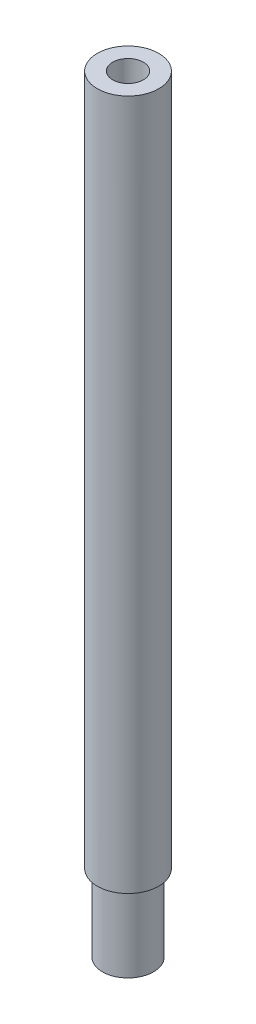
ISO-10303-21;
HEADER;
FILE_DESCRIPTION(('STEP AP214'),'2;1');
FILE_NAME('part.step','',(''),(''),'','','');
FILE_SCHEMA(('AUTOMOTIVE_DESIGN { 1 0 10303 214 1 1 1 1 }'));
ENDSEC;
DATA;
#1=APPLICATION_CONTEXT('core data for automotive mechanical design processes');
#2=APPLICATION_PROTOCOL_DEFINITION('international standard','automotive_design',2000,#1);
#3=PRODUCT_CONTEXT('',#1,'mechanical');
#4=PRODUCT('Part','Part','',(#3));
#5=PRODUCT_RELATED_PRODUCT_CATEGORY('part','',(#4));
#6=PRODUCT_DEFINITION_FORMATION('','',#4);
#7=PRODUCT_DEFINITION_CONTEXT('part definition',#1,'design');
#8=PRODUCT_DEFINITION('design','',#6,#7);
#9=PRODUCT_DEFINITION_SHAPE('','',#8);
#10=(LENGTH_UNIT() NAMED_UNIT(*) SI_UNIT(.MILLI.,.METRE.));
#11=(NAMED_UNIT(*) PLANE_ANGLE_UNIT() SI_UNIT($,.RADIAN.));
#12=(NAMED_UNIT(*) SI_UNIT($,.STERADIAN.) SOLID_ANGLE_UNIT());
#13=UNCERTAINTY_MEASURE_WITH_UNIT(LENGTH_MEASURE(1.E-05),#10,'distance_accuracy_value','');
#14=(GEOMETRIC_REPRESENTATION_CONTEXT(3) GLOBAL_UNCERTAINTY_ASSIGNED_CONTEXT((#13)) GLOBAL_UNIT_ASSIGNED_CONTEXT((#10,
#11,#12)) REPRESENTATION_CONTEXT('',''));
#15=CARTESIAN_POINT('',(0.,0.,0.));
#16=DIRECTION('',(0.,0.,1.));
#17=DIRECTION('',(1.,0.,0.));
#18=AXIS2_PLACEMENT_3D('',#15,#16,#17);
#19=CARTESIAN_POINT('',(0.,150.,0.));
#20=DIRECTION('',(0.,-1.,0.));
#21=DIRECTION('',(0.,0.,-1.));
#22=AXIS2_PLACEMENT_3D('',#19,#20,#21);
#23=CYLINDRICAL_SURFACE('',#22,6.00000000000001);
#24=CARTESIAN_POINT('',(0.,150.,0.));
#25=DIRECTION('',(0.,1.,0.));
#26=DIRECTION('',(0.,0.,1.));
#27=AXIS2_PLACEMENT_3D('',#24,#25,#26);
#28=CIRCLE('',#27,6.00000000000001);
#29=CARTESIAN_POINT('',(0.,150.,6.00000000000001));
#30=VERTEX_POINT('',#29);
#31=EDGE_CURVE('E10',#30,#30,#28,.T.);
#32=ORIENTED_EDGE('',*,*,#31,.F.);
#33=EDGE_LOOP('',(#32));
#34=FACE_BOUND('',#33,.T.);
#35=CARTESIAN_POINT('',(1.25,142.,-5.86834729715276));
#36=CARTESIAN_POINT('',(1.249997508776,141.930609384849,-5.86834869213646));
#37=CARTESIAN_POINT('',(1.24420229433948,141.861188027985,-5.86959145924544));
#38=CARTESIAN_POINT('',(1.2211964923378,141.724313682683,-5.87442015581798));
#39=CARTESIAN_POINT('',(1.20397715440343,141.656862244494,-5.87800788138388));
#40=CARTESIAN_POINT('',(1.15868397507231,141.525927627165,-5.8871029296193));
#41=CARTESIAN_POINT('',(1.13062141248934,141.462440404008,-5.89260825706946));
#42=CARTESIAN_POINT('',(1.06446988601734,141.341075500354,-5.90491581335742));
#43=CARTESIAN_POINT('',(1.02638132735821,141.28319759327,-5.91171798977623));
#44=CARTESIAN_POINT('',(0.940636399466102,141.173804624847,-5.92596934661468));
#45=CARTESIAN_POINT('',(0.892855554869691,141.122388106374,-5.93342614373039));
#46=CARTESIAN_POINT('',(0.789351223880671,141.028238931352,-5.94807966802575));
#47=CARTESIAN_POINT('',(0.733627155456047,140.985506911709,-5.95527637609915));
#48=CARTESIAN_POINT('',(0.615162052999633,140.909554111917,-5.96868135118848));
#49=CARTESIAN_POINT('',(0.552359428204976,140.876427473537,-5.97487958631243));
#50=CARTESIAN_POINT('',(0.421928551006745,140.82123394714,-5.98550347343303));
#51=CARTESIAN_POINT('',(0.354300789950616,140.799165934846,-5.98992930561223));
#52=CARTESIAN_POINT('',(0.217162904200528,140.767024238883,-5.99645589892179));
#53=CARTESIAN_POINT('',(0.147693380916384,140.756783982805,-5.99858891959927));
#54=CARTESIAN_POINT('',(0.00799184883955263,140.748068304243,-6.00040112580613));
#55=CARTESIAN_POINT('',(-0.0622400797368088,140.749591655807,-6.00008056703691));
#56=CARTESIAN_POINT('',(-0.200326586199542,140.764234600957,-5.99704658090512));
#57=CARTESIAN_POINT('',(-0.268201128726448,140.777174718958,-5.99437018956585));
#58=CARTESIAN_POINT('',(-0.400793746289726,140.813998625331,-5.98696720898886));
#59=CARTESIAN_POINT('',(-0.465511687510995,140.837882877203,-5.98224053291905));
#60=CARTESIAN_POINT('',(-0.590460005384661,140.896080052125,-5.97120767323924));
#61=CARTESIAN_POINT('',(-0.650657134981632,140.93046229421,-5.96489104125347));
#62=CARTESIAN_POINT('',(-0.764493456510632,141.00862800284,-5.95137300440189));
#63=CARTESIAN_POINT('',(-0.8181318318164,141.052412638206,-5.94417148958325));
#64=CARTESIAN_POINT('',(-0.918394203276895,141.149121624891,-5.92951700233276));
#65=CARTESIAN_POINT('',(-0.964866487494781,141.202203059982,-5.92206184975926));
#66=CARTESIAN_POINT('',(-1.04827597240487,141.315482048995,-5.90786872648996));
#67=CARTESIAN_POINT('',(-1.08521296069979,141.375679761387,-5.90113077177161));
#68=CARTESIAN_POINT('',(-1.14856217138454,141.501712254829,-5.88912998409156));
#69=CARTESIAN_POINT('',(-1.17494805489727,141.567560650693,-5.88387085232125));
#70=CARTESIAN_POINT('',(-1.21623577538672,141.702891619369,-5.87547606410361));
#71=CARTESIAN_POINT('',(-1.23113924882348,141.772373672808,-5.87234010507183));
#72=CARTESIAN_POINT('',(-1.24880863867017,141.911619706319,-5.86860783239133));
#73=CARTESIAN_POINT('',(-1.25179442917999,141.981354584537,-5.86796551863475));
#74=CARTESIAN_POINT('',(-1.24613693439295,142.12032581154,-5.86916952018704));
#75=CARTESIAN_POINT('',(-1.23749436857863,142.189562190902,-5.87101568152624));
#76=CARTESIAN_POINT('',(-1.20901558325484,142.324820516058,-5.87694538226167));
#77=CARTESIAN_POINT('',(-1.18929841376872,142.390868667179,-5.88100511282998));
#78=CARTESIAN_POINT('',(-1.13935810860921,142.518723989442,-5.8908833850312));
#79=CARTESIAN_POINT('',(-1.10913404556148,142.58053078565,-5.89670208191057));
#80=CARTESIAN_POINT('',(-1.03854598181486,142.699106441216,-5.90954501937191));
#81=CARTESIAN_POINT('',(-0.998045327353976,142.755792204466,-5.91658506648324));
#82=CARTESIAN_POINT('',(-0.908234440569894,142.861643249155,-5.93103483993908));
#83=CARTESIAN_POINT('',(-0.858923220505197,142.910807686239,-5.93844460766532));
#84=CARTESIAN_POINT('',(-0.751900450843371,143.001062713097,-5.95294924316737));
#85=CARTESIAN_POINT('',(-0.694061907614579,143.042004095026,-5.9600367471991));
#86=CARTESIAN_POINT('',(-0.572200102216388,143.113588752088,-5.97296708772407));
#87=CARTESIAN_POINT('',(-0.508177113476914,143.144232482237,-5.97880997920819));
#88=CARTESIAN_POINT('',(-0.376142117847957,143.194138679317,-5.98856148270679));
#89=CARTESIAN_POINT('',(-0.308156710970233,143.213469165544,-5.99248163136497));
#90=CARTESIAN_POINT('',(-0.169813400503514,143.240414404008,-5.99799561410227));
#91=CARTESIAN_POINT('',(-0.0994558094617379,143.248030693533,-5.99958975342889));
#92=CARTESIAN_POINT('',(0.0402133434702962,143.251267622049,-6.00026408056942));
#93=CARTESIAN_POINT('',(0.10951959217788,143.247111899995,-5.99939113754811));
#94=CARTESIAN_POINT('',(0.246422870373516,143.227419361347,-5.99532874094473));
#95=CARTESIAN_POINT('',(0.314019925202671,143.211882713593,-5.99213932172839));
#96=CARTESIAN_POINT('',(0.445431965492025,143.169972205351,-5.98380460077544));
#97=CARTESIAN_POINT('',(0.509256550004496,143.143627336147,-5.97866453407557));
#98=CARTESIAN_POINT('',(0.631610567220715,143.080877602268,-5.96697995347705));
#99=CARTESIAN_POINT('',(0.690139538279488,143.044471861657,-5.96043531730247));
#100=CARTESIAN_POINT('',(0.801340321298242,142.961890332007,-5.94651596786387));
#101=CARTESIAN_POINT('',(0.853892633615908,142.915555711943,-5.93912880302852));
#102=CARTESIAN_POINT('',(0.950552741980371,142.814755499003,-5.9244278681135));
#103=CARTESIAN_POINT('',(0.994658521571224,142.760287970052,-5.91711411595369));
#104=CARTESIAN_POINT('',(1.07367451852766,142.643990897567,-5.90329191643328));
#105=CARTESIAN_POINT('',(1.10846928126993,142.582081588538,-5.89679406702552));
#106=CARTESIAN_POINT('',(1.16710627925305,142.453174843917,-5.88547039658064));
#107=CARTESIAN_POINT('',(1.19095816292459,142.386181951547,-5.88064310352601));
#108=CARTESIAN_POINT('',(1.2225655413186,142.265893718432,-5.87414004405197));
#109=CARTESIAN_POINT('',(1.2328344900567,142.213270463407,-5.87198163591589));
#110=CARTESIAN_POINT('',(1.24655254358404,142.107104219479,-5.86908475266778));
#111=CARTESIAN_POINT('',(1.25000192292741,142.05356126769,-5.86834622039194));
#112=CARTESIAN_POINT('',(1.25,142.,-5.86834729715276));
#113=B_SPLINE_CURVE_WITH_KNOTS('',3,(#35,#36,#37,#38,#39,#40,#41,#42,#43,#44,#45,#46,#47,#48,
#49,#50,#51,#52,#53,#54,#55,#56,#57,#58,#59,#60,#61,#62,#63,#64,#65,#66,#67,#68,#69,#70,#71,#72,
#73,#74,#75,#76,#77,#78,#79,#80,#81,#82,#83,#84,#85,#86,#87,#88,#89,#90,#91,#92,#93,#94,#95,#96,
#97,#98,#99,#100,#101,#102,#103,#104,#105,#106,#107,#108,#109,#110,#111,#112),.UNSPECIFIED.,.T.,
.F.,(4,2,2,2,2,2,2,2,2,2,2,2,2,2,2,2,2,2,2,2,2,2,2,2,2,2,2,2,2,2,2,2,2,2,2,2,2,2,4),(0.,
0.207975654071235,0.416110792417448,0.624030014802686,0.831940834815764,1.0427133346788,
1.25350128663869,1.46629026266841,1.67905760106931,1.88879048859262,2.09850151896336,
2.30497341416459,2.51145405455868,2.71932871977947,2.92722924104258,3.13905862244912,
3.35089272191626,3.56325237332489,3.77558175387596,3.98397516009789,4.19235567296522,
4.39853786231921,4.60473825464029,4.81383917934652,5.02296356082183,5.23559458753342,
5.44821621759037,5.65954599648531,5.87084803959578,6.07816293922642,6.28547476332979,
6.49223410585099,6.69901145528171,6.90938318978573,7.11980508427535,7.33272651358121,
7.54545984571985,7.70599867585768,7.86653104261162),.UNSPECIFIED.);
#114=CARTESIAN_POINT('',(1.25,142.,-5.86834729715276));
#115=VERTEX_POINT('',#114);
#116=EDGE_CURVE('E51',#115,#115,#113,.T.);
#117=ORIENTED_EDGE('',*,*,#116,.F.);
#118=EDGE_LOOP('',(#117));
#119=FACE_BOUND('',#118,.T.);
#120=CARTESIAN_POINT('',(0.,15.,0.));
#121=DIRECTION('',(0.,-1.,0.));
#122=DIRECTION('',(0.,0.,-1.));
#123=AXIS2_PLACEMENT_3D('',#120,#121,#122);
#124=CIRCLE('',#123,6.00000000000001);
#125=CARTESIAN_POINT('',(0.,15.,-6.00000000000001));
#126=VERTEX_POINT('',#125);
#127=EDGE_CURVE('E100',#126,#126,#124,.T.);
#128=ORIENTED_EDGE('',*,*,#127,.F.);
#129=EDGE_LOOP('',(#128));
#130=FACE_BOUND('',#129,.T.);
#131=ADVANCED_FACE('F37',(#34,#119,#130),#23,.T.);
#132=CARTESIAN_POINT('',(0.,150.,0.));
#133=DIRECTION('',(0.,1.,0.));
#134=DIRECTION('',(0.,0.,1.));
#135=AXIS2_PLACEMENT_3D('',#132,#133,#134);
#136=PLANE('',#135);
#137=CARTESIAN_POINT('',(0.,150.,0.));
#138=DIRECTION('',(0.,1.,0.));
#139=DIRECTION('',(0.,0.,1.));
#140=AXIS2_PLACEMENT_3D('',#137,#138,#139);
#141=CIRCLE('',#140,3.);
#142=CARTESIAN_POINT('',(0.,150.,3.));
#143=VERTEX_POINT('',#142);
#144=EDGE_CURVE('E40',#143,#143,#141,.F.);
#145=ORIENTED_EDGE('',*,*,#144,.T.);
#146=EDGE_LOOP('',(#145));
#147=FACE_BOUND('',#146,.T.);
#148=ORIENTED_EDGE('',*,*,#31,.T.);
#149=EDGE_LOOP('',(#148));
#150=FACE_BOUND('',#149,.T.);
#151=ADVANCED_FACE('F86',(#147,#150),#136,.T.);
#152=CARTESIAN_POINT('',(0.,150.000012,0.));
#153=DIRECTION('',(0.,-1.,0.));
#154=DIRECTION('',(0.,0.,-1.));
#155=AXIS2_PLACEMENT_3D('',#152,#153,#154);
#156=CYLINDRICAL_SURFACE('',#155,3.);
#157=CARTESIAN_POINT('',(1.25,142.,-2.72717802865893));
#158=CARTESIAN_POINT('',(1.24999259066568,141.933328109103,-2.72718519563219));
#159=CARTESIAN_POINT('',(1.24463203881503,141.866547343174,-2.729658595344));
#160=CARTESIAN_POINT('',(1.22339678947785,141.734913057943,-2.73923833650884));
#161=CARTESIAN_POINT('',(1.20749354003276,141.670065273325,-2.74635725824267));
#162=CARTESIAN_POINT('',(1.16589988419451,141.544438870309,-2.76426917574768));
#163=CARTESIAN_POINT('',(1.14024937431428,141.483644836285,-2.77504717562616));
#164=CARTESIAN_POINT('',(1.08000637754462,141.367240550422,-2.79904148565793));
#165=CARTESIAN_POINT('',(1.04541600591531,141.311629076567,-2.81225721880783));
#166=CARTESIAN_POINT('',(0.965973882676165,141.203674275027,-2.84055762619857));
#167=CARTESIAN_POINT('',(0.920653238184407,141.151692441256,-2.85570568079146));
#168=CARTESIAN_POINT('',(0.82202167574555,141.055799777502,-2.88564295372227));
#169=CARTESIAN_POINT('',(0.768707691374005,141.011892059387,-2.90043203180789));
#170=CARTESIAN_POINT('',(0.652763393797354,140.931550469121,-2.92875537930613));
#171=CARTESIAN_POINT('',(0.58982929368367,140.895523371968,-2.94220739975291));
#172=CARTESIAN_POINT('',(0.45813202236237,140.834723979494,-2.96556519993425));
#173=CARTESIAN_POINT('',(0.389371454872143,140.809946688036,-2.97547255347157));
#174=CARTESIAN_POINT('',(0.251768498025183,140.773660541243,-2.99017521042367));
#175=CARTESIAN_POINT('',(0.183116576196095,140.761528305098,-2.99520971127466));
#176=CARTESIAN_POINT('',(0.0445791803650148,140.74886235884,-3.00046828611204));
#177=CARTESIAN_POINT('',(-0.0253057817645107,140.748323944117,-3.00069431131015));
#178=CARTESIAN_POINT('',(-0.159792780112563,140.758534280933,-2.99645129133057));
#179=CARTESIAN_POINT('',(-0.224457488607307,140.768598100526,-2.99226714648664));
#180=CARTESIAN_POINT('',(-0.351082893931449,140.798553102638,-2.98006516750309));
#181=CARTESIAN_POINT('',(-0.41304339105491,140.81844500963,-2.97204705074577));
#182=CARTESIAN_POINT('',(-0.533638118077519,140.867728040895,-2.95279852414029));
#183=CARTESIAN_POINT('',(-0.592207177074898,140.897259462871,-2.94152097126085));
#184=CARTESIAN_POINT('',(-0.703711767281955,140.9648457567,-2.91685713989805));
#185=CARTESIAN_POINT('',(-0.756645297756967,141.002903640845,-2.90347011666255));
#186=CARTESIAN_POINT('',(-0.859340911707921,141.089582420405,-2.87481698777061));
#187=CARTESIAN_POINT('',(-0.90861643731624,141.138758791279,-2.8594849435601));
#188=CARTESIAN_POINT('',(-0.998431414927669,141.244711440707,-2.8293786068147));
#189=CARTESIAN_POINT('',(-1.03896749582431,141.301490638292,-2.8146045313137));
#190=CARTESIAN_POINT('',(-1.11140189250064,141.423395036662,-2.78681612355338));
#191=CARTESIAN_POINT('',(-1.14297253355541,141.488733205743,-2.77387558556714));
#192=CARTESIAN_POINT('',(-1.19446432058392,141.624481044974,-2.75209844221011));
#193=CARTESIAN_POINT('',(-1.21439379627313,141.69488704827,-2.74325890334594));
#194=CARTESIAN_POINT('',(-1.24080025168121,141.833896808914,-2.73141212519724));
#195=CARTESIAN_POINT('',(-1.24806614632866,141.902321122259,-2.72806369197117));
#196=CARTESIAN_POINT('',(-1.25125630518999,142.039478482411,-2.72660286810642));
#197=CARTESIAN_POINT('',(-1.24718449318149,142.108211414192,-2.72848866599319));
#198=CARTESIAN_POINT('',(-1.22853477565556,142.23939838543,-2.73693131345749));
#199=CARTESIAN_POINT('',(-1.21464618818049,142.301972686787,-2.74318138016617));
#200=CARTESIAN_POINT('',(-1.17767058564226,142.423851296498,-2.75925630297446));
#201=CARTESIAN_POINT('',(-1.15458142053126,142.483154836831,-2.76908199460161));
#202=CARTESIAN_POINT('',(-1.09877520805187,142.599615310356,-2.79170797857));
#203=CARTESIAN_POINT('',(-1.06569183306198,142.65657497461,-2.80461662202282));
#204=CARTESIAN_POINT('',(-0.991200784385975,142.764408052499,-2.83180003740794));
#205=CARTESIAN_POINT('',(-0.949789507875998,142.815278816702,-2.84607539920583));
#206=CARTESIAN_POINT('',(-0.855844455715518,142.913800134884,-2.87578619784532));
#207=CARTESIAN_POINT('',(-0.802679661479745,142.960851399951,-2.89122146708841));
#208=CARTESIAN_POINT('',(-0.688851512553537,143.045472291979,-2.92043361183923));
#209=CARTESIAN_POINT('',(-0.628187608803652,143.083041224064,-2.93421036577014));
#210=CARTESIAN_POINT('',(-0.500654680803382,143.147589875444,-2.9586425158565));
#211=CARTESIAN_POINT('',(-0.43377016963851,143.174542241289,-2.96928983138826));
#212=CARTESIAN_POINT('',(-0.29585883515443,143.216616792334,-2.98618173103366));
#213=CARTESIAN_POINT('',(-0.224834504225212,143.231746018226,-2.9924289351992));
#214=CARTESIAN_POINT('',(-0.0860165335064313,143.24885812552,-2.9995153479751));
#215=CARTESIAN_POINT('',(-0.0183440847939168,143.251685999697,-3.00070204534225));
#216=CARTESIAN_POINT('',(0.116486811714267,143.246386858706,-2.99849523480953));
#217=CARTESIAN_POINT('',(0.183645347541137,143.238261763987,-2.99510252984313));
#218=CARTESIAN_POINT('',(0.313086482449171,143.211893927841,-2.98430065981735));
#219=CARTESIAN_POINT('',(0.37545753784356,143.19402031953,-2.97703824209233));
#220=CARTESIAN_POINT('',(0.496292230501321,143.149065752791,-2.95929499847058));
#221=CARTESIAN_POINT('',(0.554755122985811,143.121983045335,-2.94881356124207));
#222=CARTESIAN_POINT('',(0.669024565478765,143.058010470786,-2.92505825398663));
#223=CARTESIAN_POINT('',(0.724591657976671,143.020732698576,-2.91167959188766));
#224=CARTESIAN_POINT('',(0.828918675638775,142.937992817128,-2.88371561874231));
#225=CARTESIAN_POINT('',(0.877676061786034,142.892527669593,-2.86912986083797));
#226=CARTESIAN_POINT('',(0.970449787231572,142.791055174146,-2.83914845259141));
#227=CARTESIAN_POINT('',(1.01391775364846,142.734540985379,-2.82376522857896));
#228=CARTESIAN_POINT('',(1.09083332306674,142.61454125932,-2.79495552690186));
#229=CARTESIAN_POINT('',(1.12427532456754,142.551051851942,-2.78153014522559));
#230=CARTESIAN_POINT('',(1.17982766043577,142.419056164977,-2.75842557732643));
#231=CARTESIAN_POINT('',(1.20199823632854,142.350578841207,-2.74872654469865));
#232=CARTESIAN_POINT('',(1.23423556453801,142.210460426149,-2.73440803066667));
#233=CARTESIAN_POINT('',(1.2443429152121,142.138830792726,-2.72977151604981));
#234=CARTESIAN_POINT('',(1.2494046492365,142.044641475738,-2.72744979732688));
#235=CARTESIAN_POINT('',(1.25000248121118,142.022326842612,-2.72717562860874));
#236=CARTESIAN_POINT('',(1.25,142.,-2.72717802865893));
#237=B_SPLINE_CURVE_WITH_KNOTS('',3,(#157,#158,#159,#160,#161,#162,#163,#164,#165,#166,#167,
#168,#169,#170,#171,#172,#173,#174,#175,#176,#177,#178,#179,#180,#181,#182,#183,#184,#185,#186,
#187,#188,#189,#190,#191,#192,#193,#194,#195,#196,#197,#198,#199,#200,#201,#202,#203,#204,#205,
#206,#207,#208,#209,#210,#211,#212,#213,#214,#215,#216,#217,#218,#219,#220,#221,#222,#223,#224,
#225,#226,#227,#228,#229,#230,#231,#232,#233,#234,#235,#236),.UNSPECIFIED.,.T.,.F.,(4,2,2,2,2,2,
2,2,2,2,2,2,2,2,2,2,2,2,2,2,2,2,2,2,2,2,2,2,2,2,2,2,2,2,2,2,2,2,2,4),(0.,0.199951711985529,
0.400447161842174,0.600130652152139,0.799766938550116,1.01066841430654,1.2216510045991,
1.44178476577922,1.66182066774889,1.87040605977951,2.0789068091793,2.27471840245092,
2.47054443201882,2.66935814640065,2.86824221022482,3.08114531844483,3.29413040441367,
3.51411545666723,3.73394290745569,3.93950778306309,4.14500152518448,4.33733901066188,
4.52972146913531,4.7302512681817,4.93086800795464,5.14781662735513,5.36478114041867,
5.58230105955595,5.79969134643005,6.00188635094052,6.20404590801913,6.39903415036486,
6.59405944632172,6.79789862829035,7.00181361048903,7.21960426908077,7.43751638139188,
7.65425125796868,7.87025464546163,7.93721375436706),.UNSPECIFIED.);
#238=CARTESIAN_POINT('',(1.25,142.,-2.72717802865893));
#239=VERTEX_POINT('',#238);
#240=EDGE_CURVE('E59',#239,#239,#237,.T.);
#241=ORIENTED_EDGE('',*,*,#240,.T.);
#242=EDGE_LOOP('',(#241));
#243=FACE_BOUND('',#242,.T.);
#244=ORIENTED_EDGE('',*,*,#144,.F.);
#245=EDGE_LOOP('',(#244));
#246=FACE_BOUND('',#245,.T.);
#247=CARTESIAN_POINT('',(0.,132.,0.));
#248=DIRECTION('',(0.,1.,0.));
#249=DIRECTION('',(0.,0.,1.));
#250=AXIS2_PLACEMENT_3D('',#247,#248,#249);
#251=CIRCLE('',#250,3.);
#252=CARTESIAN_POINT('',(0.,132.,3.));
#253=VERTEX_POINT('',#252);
#254=EDGE_CURVE('E47',#253,#253,#251,.T.);
#255=ORIENTED_EDGE('',*,*,#254,.F.);
#256=EDGE_LOOP('',(#255));
#257=FACE_BOUND('',#256,.T.);
#258=ADVANCED_FACE('F92',(#243,#246,#257),#156,.F.);
#259=CARTESIAN_POINT('',(0.,132.,0.));
#260=DIRECTION('',(0.,1.,0.));
#261=DIRECTION('',(0.,0.,1.));
#262=AXIS2_PLACEMENT_3D('',#259,#260,#261);
#263=PLANE('',#262);
#264=ORIENTED_EDGE('',*,*,#254,.T.);
#265=EDGE_LOOP('',(#264));
#266=FACE_BOUND('',#265,.T.);
#267=ADVANCED_FACE('F115',(#266),#263,.T.);
#268=CARTESIAN_POINT('',(0.,142.,-6.00100000000001));
#269=DIRECTION('',(0.,0.,1.));
#270=DIRECTION('',(1.,0.,0.));
#271=AXIS2_PLACEMENT_3D('',#268,#269,#270);
#272=CYLINDRICAL_SURFACE('',#271,1.25);
#273=ORIENTED_EDGE('',*,*,#240,.F.);
#274=EDGE_LOOP('',(#273));
#275=FACE_BOUND('',#274,.T.);
#276=ORIENTED_EDGE('',*,*,#116,.T.);
#277=EDGE_LOOP('',(#276));
#278=FACE_BOUND('',#277,.T.);
#279=ADVANCED_FACE('F65',(#275,#278),#272,.F.);
#280=CARTESIAN_POINT('',(0.,15.,0.));
#281=DIRECTION('',(0.,-1.,0.));
#282=DIRECTION('',(0.,0.,-1.));
#283=AXIS2_PLACEMENT_3D('',#280,#281,#282);
#284=PLANE('',#283);
#285=CARTESIAN_POINT('',(0.,15.,0.));
#286=DIRECTION('',(0.,-1.,0.));
#287=DIRECTION('',(0.,0.,-1.));
#288=AXIS2_PLACEMENT_3D('',#285,#286,#287);
#289=CIRCLE('',#288,5.);
#290=CARTESIAN_POINT('',(0.,15.,-5.));
#291=VERTEX_POINT('',#290);
#292=EDGE_CURVE('E102',#291,#291,#289,.T.);
#293=ORIENTED_EDGE('',*,*,#292,.F.);
#294=EDGE_LOOP('',(#293));
#295=FACE_BOUND('',#294,.T.);
#296=ORIENTED_EDGE('',*,*,#127,.T.);
#297=EDGE_LOOP('',(#296));
#298=FACE_BOUND('',#297,.T.);
#299=ADVANCED_FACE('F71',(#295,#298),#284,.T.);
#300=CARTESIAN_POINT('',(0.,15.,0.));
#301=DIRECTION('',(0.,-1.,0.));
#302=DIRECTION('',(0.,0.,-1.));
#303=AXIS2_PLACEMENT_3D('',#300,#301,#302);
#304=CYLINDRICAL_SURFACE('',#303,5.);
#305=ORIENTED_EDGE('',*,*,#292,.T.);
#306=EDGE_LOOP('',(#305));
#307=FACE_BOUND('',#306,.T.);
#308=CARTESIAN_POINT('',(0.,0.,0.));
#309=DIRECTION('',(0.,-1.,0.));
#310=DIRECTION('',(0.,0.,-1.));
#311=AXIS2_PLACEMENT_3D('',#308,#309,#310);
#312=CIRCLE('',#311,5.);
#313=CARTESIAN_POINT('',(0.,0.,-5.));
#314=VERTEX_POINT('',#313);
#315=EDGE_CURVE('E104',#314,#314,#312,.T.);
#316=ORIENTED_EDGE('',*,*,#315,.F.);
#317=EDGE_LOOP('',(#316));
#318=FACE_BOUND('',#317,.T.);
#319=ADVANCED_FACE('F74',(#307,#318),#304,.T.);
#320=CARTESIAN_POINT('',(0.,0.,0.));
#321=DIRECTION('',(0.,1.,0.));
#322=DIRECTION('',(0.,0.,1.));
#323=AXIS2_PLACEMENT_3D('',#320,#321,#322);
#324=PLANE('',#323);
#325=ORIENTED_EDGE('',*,*,#315,.T.);
#326=EDGE_LOOP('',(#325));
#327=FACE_BOUND('',#326,.T.);
#328=ADVANCED_FACE('F77',(#327),#324,.F.);
#329=CLOSED_SHELL('',(#131,#151,#258,#267,#279,#299,#319,#328));
#330=MANIFOLD_SOLID_BREP('B2',#329);
#331=ADVANCED_BREP_SHAPE_REPRESENTATION('',(#18,#330),#14);
#332=SHAPE_DEFINITION_REPRESENTATION(#9,#331);
ENDSEC;
END-ISO-10303-21;
